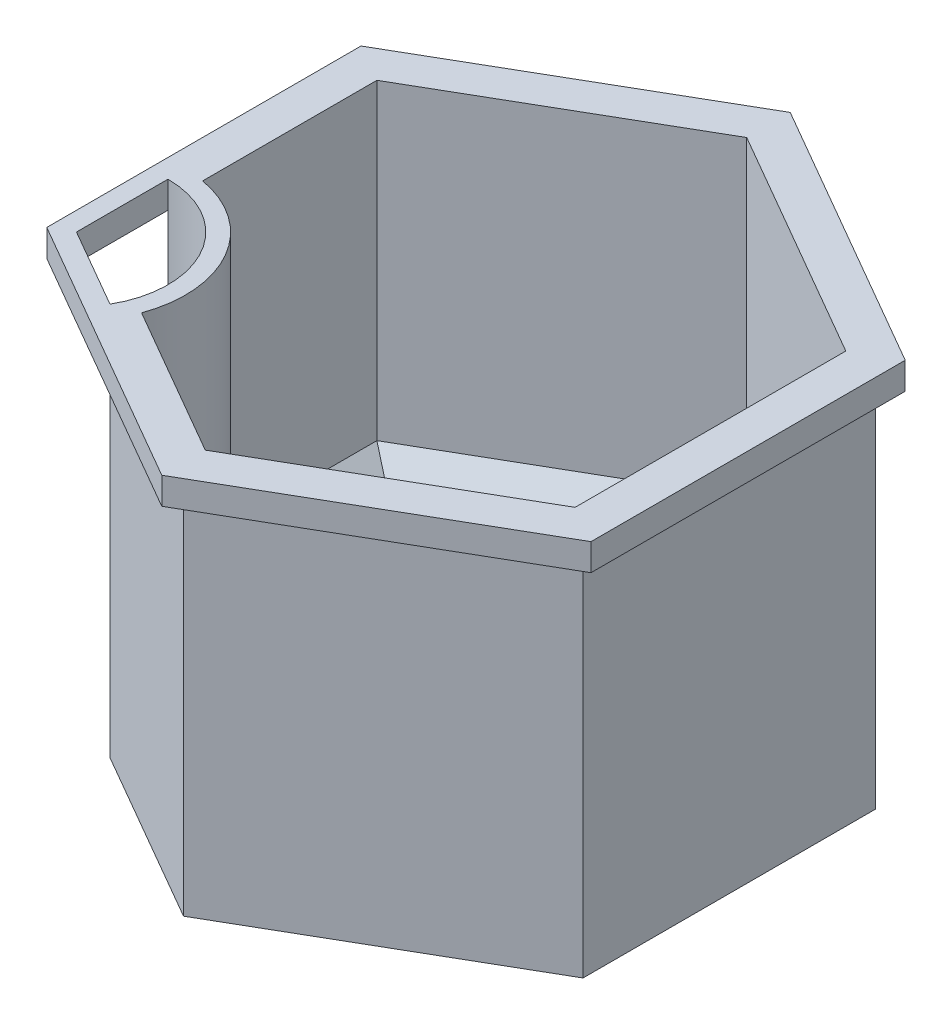
ISO-10303-21;
HEADER;
FILE_DESCRIPTION(('STEP AP214'),'2;1');
FILE_NAME('part.step','',(''),(''),'','','');
FILE_SCHEMA(('AUTOMOTIVE_DESIGN { 1 0 10303 214 1 1 1 1 }'));
ENDSEC;
DATA;
#1=APPLICATION_CONTEXT('core data for automotive mechanical design processes');
#2=APPLICATION_PROTOCOL_DEFINITION('international standard','automotive_design',2000,#1);
#3=PRODUCT_CONTEXT('',#1,'mechanical');
#4=PRODUCT('Part','Part','',(#3));
#5=PRODUCT_RELATED_PRODUCT_CATEGORY('part','',(#4));
#6=PRODUCT_DEFINITION_FORMATION('','',#4);
#7=PRODUCT_DEFINITION_CONTEXT('part definition',#1,'design');
#8=PRODUCT_DEFINITION('design','',#6,#7);
#9=PRODUCT_DEFINITION_SHAPE('','',#8);
#10=(LENGTH_UNIT() NAMED_UNIT(*) SI_UNIT(.MILLI.,.METRE.));
#11=(NAMED_UNIT(*) PLANE_ANGLE_UNIT() SI_UNIT($,.RADIAN.));
#12=(NAMED_UNIT(*) SI_UNIT($,.STERADIAN.) SOLID_ANGLE_UNIT());
#13=UNCERTAINTY_MEASURE_WITH_UNIT(LENGTH_MEASURE(1.E-05),#10,'distance_accuracy_value','');
#14=(GEOMETRIC_REPRESENTATION_CONTEXT(3) GLOBAL_UNCERTAINTY_ASSIGNED_CONTEXT((#13)) GLOBAL_UNIT_ASSIGNED_CONTEXT((#10,
#11,#12)) REPRESENTATION_CONTEXT('',''));
#15=CARTESIAN_POINT('',(0.,0.,0.));
#16=DIRECTION('',(0.,0.,1.));
#17=DIRECTION('',(1.,0.,0.));
#18=AXIS2_PLACEMENT_3D('',#15,#16,#17);
#19=CARTESIAN_POINT('',(-43.5772692216573,-63.,25.1593481156726));
#20=DIRECTION('',(-0.5,0.,0.866025403784439));
#21=DIRECTION('',(0.866025403784439,0.,0.5));
#22=AXIS2_PLACEMENT_3D('',#19,#20,#21);
#23=PLANE('',#22);
#24=DIRECTION('',(0.,1.,0.));
#25=VECTOR('',#24,1.);
#26=CARTESIAN_POINT('',(0.,-63.,50.3186962313452));
#27=LINE('',#26,#25);
#28=CARTESIAN_POINT('',(0.,-53.,50.3186962313452));
#29=VERTEX_POINT('',#28);
#30=CARTESIAN_POINT('',(0.,5.,50.3186962313452));
#31=VERTEX_POINT('',#30);
#32=EDGE_CURVE('E479',#29,#31,#27,.T.);
#33=ORIENTED_EDGE('',*,*,#32,.F.);
#34=DIRECTION('',(-0.866025403784439,0.,-0.5));
#35=VECTOR('',#34,1.);
#36=CARTESIAN_POINT('',(-43.5772692216573,-53.,25.1593481156726));
#37=LINE('',#36,#35);
#38=CARTESIAN_POINT('',(-28.0179829484626,-53.,34.1425062339));
#39=VERTEX_POINT('',#38);
#40=EDGE_CURVE('E11',#29,#39,#37,.T.);
#41=ORIENTED_EDGE('',*,*,#40,.T.);
#42=DIRECTION('',(0.,1.,0.));
#43=VECTOR('',#42,1.);
#44=CARTESIAN_POINT('',(-28.0179829484626,-68.,34.1425062339));
#45=LINE('',#44,#43);
#46=CARTESIAN_POINT('',(-28.0179829484626,5.,34.1425062339));
#47=VERTEX_POINT('',#46);
#48=EDGE_CURVE('E449',#39,#47,#45,.T.);
#49=ORIENTED_EDGE('',*,*,#48,.T.);
#50=DIRECTION('',(0.866025403784439,0.,0.5));
#51=VECTOR('',#50,1.);
#52=CARTESIAN_POINT('',(-43.5772692216573,5.,25.1593481156726));
#53=LINE('',#52,#51);
#54=EDGE_CURVE('E474',#47,#31,#53,.T.);
#55=ORIENTED_EDGE('',*,*,#54,.T.);
#56=EDGE_LOOP('',(#33,#41,#49,#55));
#57=FACE_BOUND('',#56,.T.);
#58=ADVANCED_FACE('F42',(#57),#23,.F.);
#59=CARTESIAN_POINT('',(-43.5772692216573,-63.,-25.1593481156726));
#60=DIRECTION('',(-1.,0.,0.));
#61=DIRECTION('',(0.,0.,1.));
#62=AXIS2_PLACEMENT_3D('',#59,#60,#61);
#63=PLANE('',#62);
#64=DIRECTION('',(0.,1.,0.));
#65=VECTOR('',#64,1.);
#66=CARTESIAN_POINT('',(-43.5772692216573,-68.,7.2337002478176));
#67=LINE('',#66,#65);
#68=CARTESIAN_POINT('',(-43.5772692216573,-53.,7.2337002478176));
#69=VERTEX_POINT('',#68);
#70=CARTESIAN_POINT('',(-43.5772692216573,5.,7.2337002478176));
#71=VERTEX_POINT('',#70);
#72=EDGE_CURVE('E448',#69,#71,#67,.T.);
#73=ORIENTED_EDGE('',*,*,#72,.F.);
#74=DIRECTION('',(0.,0.,-1.));
#75=VECTOR('',#74,1.);
#76=CARTESIAN_POINT('',(-43.5772692216573,-53.,-25.1593481156726));
#77=LINE('',#76,#75);
#78=CARTESIAN_POINT('',(-43.5772692216573,-53.,-25.1593481156726));
#79=VERTEX_POINT('',#78);
#80=EDGE_CURVE('E388',#69,#79,#77,.T.);
#81=ORIENTED_EDGE('',*,*,#80,.T.);
#82=DIRECTION('',(0.,1.,0.));
#83=VECTOR('',#82,1.);
#84=CARTESIAN_POINT('',(-43.5772692216573,-63.,-25.1593481156726));
#85=LINE('',#84,#83);
#86=CARTESIAN_POINT('',(-43.5772692216573,5.,-25.1593481156726));
#87=VERTEX_POINT('',#86);
#88=EDGE_CURVE('E482',#79,#87,#85,.T.);
#89=ORIENTED_EDGE('',*,*,#88,.T.);
#90=DIRECTION('',(0.,0.,1.));
#91=VECTOR('',#90,1.);
#92=CARTESIAN_POINT('',(-43.5772692216573,5.,-25.1593481156726));
#93=LINE('',#92,#91);
#94=EDGE_CURVE('E470',#87,#71,#93,.T.);
#95=ORIENTED_EDGE('',*,*,#94,.T.);
#96=EDGE_LOOP('',(#73,#81,#89,#95));
#97=FACE_BOUND('',#96,.T.);
#98=ADVANCED_FACE('F542',(#97),#63,.F.);
#99=CARTESIAN_POINT('',(0.,-63.,0.));
#100=DIRECTION('',(0.,1.,0.));
#101=DIRECTION('',(0.,0.,1.));
#102=AXIS2_PLACEMENT_3D('',#99,#100,#101);
#103=PLANE('',#102);
#104=DIRECTION('',(-0.866025403784439,0.,0.5));
#105=VECTOR('',#104,1.);
#106=CARTESIAN_POINT('',(-16.7886346108286,-63.,-29.0787681356645));
#107=LINE('',#106,#105);
#108=CARTESIAN_POINT('',(0.,-63.,-38.7716908475527));
#109=VERTEX_POINT('',#108);
#110=CARTESIAN_POINT('',(-33.5772692216572,-63.,-19.3858454237763));
#111=VERTEX_POINT('',#110);
#112=EDGE_CURVE('E375',#109,#111,#107,.T.);
#113=ORIENTED_EDGE('',*,*,#112,.T.);
#114=DIRECTION('',(0.,0.,1.));
#115=VECTOR('',#114,1.);
#116=CARTESIAN_POINT('',(-33.5772692216572,-63.,0.));
#117=LINE('',#116,#115);
#118=CARTESIAN_POINT('',(-33.5772692216572,-63.,12.07543763408));
#119=VERTEX_POINT('',#118);
#120=EDGE_CURVE('E378',#111,#119,#117,.T.);
#121=ORIENTED_EDGE('',*,*,#120,.T.);
#122=CARTESIAN_POINT('',(-47.0772692216573,-63.,27.2102505525071));
#123=DIRECTION('',(0.,1.,0.));
#124=DIRECTION('',(0.,0.,1.));
#125=AXIS2_PLACEMENT_3D('',#122,#123,#124);
#126=CIRCLE('',#125,20.2808422427618);
#127=CARTESIAN_POINT('',(-27.2272927843915,-63.,23.0520060291795));
#128=VERTEX_POINT('',#127);
#129=EDGE_CURVE('E359',#119,#128,#126,.F.);
#130=ORIENTED_EDGE('',*,*,#129,.T.);
#131=DIRECTION('',(0.866025403784439,0.,0.5));
#132=VECTOR('',#131,1.);
#133=CARTESIAN_POINT('',(-16.7886346108286,-63.,29.0787681356645));
#134=LINE('',#133,#132);
#135=CARTESIAN_POINT('',(0.,-63.,38.7716908475527));
#136=VERTEX_POINT('',#135);
#137=EDGE_CURVE('E363',#128,#136,#134,.T.);
#138=ORIENTED_EDGE('',*,*,#137,.T.);
#139=DIRECTION('',(0.866025403784439,0.,-0.5));
#140=VECTOR('',#139,1.);
#141=CARTESIAN_POINT('',(16.7886346108286,-63.,29.0787681356645));
#142=LINE('',#141,#140);
#143=CARTESIAN_POINT('',(33.5772692216572,-63.,19.3858454237763));
#144=VERTEX_POINT('',#143);
#145=EDGE_CURVE('E366',#136,#144,#142,.T.);
#146=ORIENTED_EDGE('',*,*,#145,.T.);
#147=DIRECTION('',(0.,0.,-1.));
#148=VECTOR('',#147,1.);
#149=CARTESIAN_POINT('',(33.5772692216572,-63.,0.));
#150=LINE('',#149,#148);
#151=CARTESIAN_POINT('',(33.5772692216572,-63.,-19.3858454237763));
#152=VERTEX_POINT('',#151);
#153=EDGE_CURVE('E369',#144,#152,#150,.T.);
#154=ORIENTED_EDGE('',*,*,#153,.T.);
#155=DIRECTION('',(-0.866025403784439,0.,-0.5));
#156=VECTOR('',#155,1.);
#157=CARTESIAN_POINT('',(16.7886346108286,-63.,-29.0787681356645));
#158=LINE('',#157,#156);
#159=EDGE_CURVE('E372',#152,#109,#158,.T.);
#160=ORIENTED_EDGE('',*,*,#159,.T.);
#161=EDGE_LOOP('',(#113,#121,#130,#138,#146,#154,#160));
#162=FACE_BOUND('',#161,.T.);
#163=ADVANCED_FACE('F548',(#162),#103,.T.);
#164=CARTESIAN_POINT('',(0.,5.,0.));
#165=DIRECTION('',(0.,1.,0.));
#166=DIRECTION('',(0.,0.,1.));
#167=AXIS2_PLACEMENT_3D('',#164,#165,#166);
#168=PLANE('',#167);
#169=DIRECTION('',(0.866025403784439,0.,0.5));
#170=VECTOR('',#169,1.);
#171=CARTESIAN_POINT('',(-47.0772692216573,5.,27.1800740578363));
#172=LINE('',#171,#170);
#173=CARTESIAN_POINT('',(-47.0772692216573,5.,27.1800740578363));
#174=VERTEX_POINT('',#173);
#175=CARTESIAN_POINT('',(-32.3548373573218,5.,35.6800740578363));
#176=VERTEX_POINT('',#175);
#177=EDGE_CURVE('E420',#174,#176,#172,.T.);
#178=ORIENTED_EDGE('',*,*,#177,.F.);
#179=DIRECTION('',(0.,0.,1.));
#180=VECTOR('',#179,1.);
#181=CARTESIAN_POINT('',(-47.0772692216573,5.,10.1800740578363));
#182=LINE('',#181,#180);
#183=CARTESIAN_POINT('',(-47.0772692216573,5.,10.1800740578363));
#184=VERTEX_POINT('',#183);
#185=EDGE_CURVE('E231',#184,#174,#182,.T.);
#186=ORIENTED_EDGE('',*,*,#185,.F.);
#187=CARTESIAN_POINT('',(-47.0772692216573,5.,27.1800740578363));
#188=DIRECTION('',(0.,1.,0.));
#189=DIRECTION('',(0.,0.,-1.));
#190=AXIS2_PLACEMENT_3D('',#187,#188,#189);
#191=CIRCLE('',#190,17.);
#192=EDGE_CURVE('E425',#176,#184,#191,.T.);
#193=ORIENTED_EDGE('',*,*,#192,.F.);
#194=EDGE_LOOP('',(#178,#186,#193));
#195=FACE_BOUND('',#194,.T.);
#196=ORIENTED_EDGE('',*,*,#54,.F.);
#197=CARTESIAN_POINT('',(-47.0772692216573,5.,27.2102505525071));
#198=DIRECTION('',(0.,1.,0.));
#199=DIRECTION('',(0.,0.,1.));
#200=AXIS2_PLACEMENT_3D('',#197,#198,#199);
#201=CIRCLE('',#200,20.2808422427618);
#202=EDGE_CURVE('E444',#71,#47,#201,.F.);
#203=ORIENTED_EDGE('',*,*,#202,.F.);
#204=ORIENTED_EDGE('',*,*,#94,.F.);
#205=DIRECTION('',(-0.866025403784439,0.,0.5));
#206=VECTOR('',#205,1.);
#207=CARTESIAN_POINT('',(0.,5.,-50.3186962313452));
#208=LINE('',#207,#206);
#209=CARTESIAN_POINT('',(0.,5.,-50.3186962313452));
#210=VERTEX_POINT('',#209);
#211=EDGE_CURVE('E466',#210,#87,#208,.T.);
#212=ORIENTED_EDGE('',*,*,#211,.F.);
#213=DIRECTION('',(-0.866025403784439,0.,-0.5));
#214=VECTOR('',#213,1.);
#215=CARTESIAN_POINT('',(43.5772692216573,5.,-25.1593481156726));
#216=LINE('',#215,#214);
#217=CARTESIAN_POINT('',(43.5772692216573,5.,-25.1593481156726));
#218=VERTEX_POINT('',#217);
#219=EDGE_CURVE('E462',#218,#210,#216,.T.);
#220=ORIENTED_EDGE('',*,*,#219,.F.);
#221=DIRECTION('',(0.,0.,-1.));
#222=VECTOR('',#221,1.);
#223=CARTESIAN_POINT('',(43.5772692216573,5.,25.1593481156726));
#224=LINE('',#223,#222);
#225=CARTESIAN_POINT('',(43.5772692216573,5.,25.1593481156726));
#226=VERTEX_POINT('',#225);
#227=EDGE_CURVE('E458',#226,#218,#224,.T.);
#228=ORIENTED_EDGE('',*,*,#227,.F.);
#229=DIRECTION('',(0.866025403784439,0.,-0.5));
#230=VECTOR('',#229,1.);
#231=CARTESIAN_POINT('',(0.,5.,50.3186962313452));
#232=LINE('',#231,#230);
#233=EDGE_CURVE('E452',#31,#226,#232,.T.);
#234=ORIENTED_EDGE('',*,*,#233,.F.);
#235=EDGE_LOOP('',(#196,#203,#204,#212,#220,#228,#234));
#236=FACE_BOUND('',#235,.T.);
#237=DIRECTION('',(0.866025403784438,0.,-0.5));
#238=VECTOR('',#237,1.);
#239=CARTESIAN_POINT('',(0.,5.,58.4016));
#240=LINE('',#239,#238);
#241=CARTESIAN_POINT('',(0.,5.,58.4016));
#242=VERTEX_POINT('',#241);
#243=CARTESIAN_POINT('',(50.5772692216572,5.,29.2008));
#244=VERTEX_POINT('',#243);
#245=EDGE_CURVE('E275',#242,#244,#240,.T.);
#246=ORIENTED_EDGE('',*,*,#245,.T.);
#247=DIRECTION('',(0.,0.,-1.));
#248=VECTOR('',#247,1.);
#249=CARTESIAN_POINT('',(50.5772692216572,5.,29.2008));
#250=LINE('',#249,#248);
#251=CARTESIAN_POINT('',(50.5772692216572,5.,-29.2008));
#252=VERTEX_POINT('',#251);
#253=EDGE_CURVE('E279',#244,#252,#250,.T.);
#254=ORIENTED_EDGE('',*,*,#253,.T.);
#255=DIRECTION('',(-0.866025403784438,0.,-0.5));
#256=VECTOR('',#255,1.);
#257=CARTESIAN_POINT('',(50.5772692216572,5.,-29.2008));
#258=LINE('',#257,#256);
#259=CARTESIAN_POINT('',(0.,5.,-58.4016));
#260=VERTEX_POINT('',#259);
#261=EDGE_CURVE('E283',#252,#260,#258,.T.);
#262=ORIENTED_EDGE('',*,*,#261,.T.);
#263=DIRECTION('',(-0.866025403784439,0.,0.5));
#264=VECTOR('',#263,1.);
#265=CARTESIAN_POINT('',(0.,5.,-58.4016));
#266=LINE('',#265,#264);
#267=CARTESIAN_POINT('',(-50.5772692216573,5.,-29.2008));
#268=VERTEX_POINT('',#267);
#269=EDGE_CURVE('E286',#260,#268,#266,.T.);
#270=ORIENTED_EDGE('',*,*,#269,.T.);
#271=DIRECTION('',(0.,0.,1.));
#272=VECTOR('',#271,1.);
#273=CARTESIAN_POINT('',(-50.5772692216573,5.,-29.2008));
#274=LINE('',#273,#272);
#275=CARTESIAN_POINT('',(-50.5772692216573,5.,29.2008));
#276=VERTEX_POINT('',#275);
#277=EDGE_CURVE('E289',#268,#276,#274,.T.);
#278=ORIENTED_EDGE('',*,*,#277,.T.);
#279=DIRECTION('',(0.866025403784439,0.,0.5));
#280=VECTOR('',#279,1.);
#281=CARTESIAN_POINT('',(-50.5772692216573,5.,29.2008));
#282=LINE('',#281,#280);
#283=EDGE_CURVE('E292',#276,#242,#282,.T.);
#284=ORIENTED_EDGE('',*,*,#283,.T.);
#285=EDGE_LOOP('',(#246,#254,#262,#270,#278,#284));
#286=FACE_BOUND('',#285,.T.);
#287=ADVANCED_FACE('F527',(#195,#236,#286),#168,.T.);
#288=CARTESIAN_POINT('',(0.,0.,0.));
#289=DIRECTION('',(0.,1.,0.));
#290=DIRECTION('',(0.,0.,1.));
#291=AXIS2_PLACEMENT_3D('',#288,#289,#290);
#292=PLANE('',#291);
#293=DIRECTION('',(0.866025403784439,0.,0.5));
#294=VECTOR('',#293,1.);
#295=CARTESIAN_POINT('',(-23.5386346108286,0.,40.7701110867545));
#296=LINE('',#295,#294);
#297=CARTESIAN_POINT('',(-47.0772692216573,0.,27.1800740578363));
#298=VERTEX_POINT('',#297);
#299=CARTESIAN_POINT('',(-32.3548373573218,0.,35.6800740578363));
#300=VERTEX_POINT('',#299);
#301=EDGE_CURVE('E352',#298,#300,#296,.T.);
#302=ORIENTED_EDGE('',*,*,#301,.T.);
#303=CARTESIAN_POINT('',(0.,0.,54.3601481156726));
#304=VERTEX_POINT('',#303);
#305=EDGE_CURVE('E238',#300,#304,#296,.T.);
#306=ORIENTED_EDGE('',*,*,#305,.T.);
#307=DIRECTION('',(0.866025403784439,0.,-0.5));
#308=VECTOR('',#307,1.);
#309=CARTESIAN_POINT('',(23.5386346108286,0.,40.7701110867545));
#310=LINE('',#309,#308);
#311=CARTESIAN_POINT('',(47.0772692216573,0.,27.1800740578363));
#312=VERTEX_POINT('',#311);
#313=EDGE_CURVE('E355',#304,#312,#310,.T.);
#314=ORIENTED_EDGE('',*,*,#313,.T.);
#315=DIRECTION('',(0.,0.,-1.));
#316=VECTOR('',#315,1.);
#317=CARTESIAN_POINT('',(47.0772692216573,0.,0.));
#318=LINE('',#317,#316);
#319=CARTESIAN_POINT('',(47.0772692216573,0.,-27.1800740578363));
#320=VERTEX_POINT('',#319);
#321=EDGE_CURVE('E336',#312,#320,#318,.T.);
#322=ORIENTED_EDGE('',*,*,#321,.T.);
#323=DIRECTION('',(-0.866025403784439,0.,-0.5));
#324=VECTOR('',#323,1.);
#325=CARTESIAN_POINT('',(23.5386346108286,0.,-40.7701110867545));
#326=LINE('',#325,#324);
#327=CARTESIAN_POINT('',(0.,0.,-54.3601481156726));
#328=VERTEX_POINT('',#327);
#329=EDGE_CURVE('E340',#320,#328,#326,.T.);
#330=ORIENTED_EDGE('',*,*,#329,.T.);
#331=DIRECTION('',(-0.866025403784439,0.,0.5));
#332=VECTOR('',#331,1.);
#333=CARTESIAN_POINT('',(-23.5386346108286,0.,-40.7701110867545));
#334=LINE('',#333,#332);
#335=CARTESIAN_POINT('',(-47.0772692216573,0.,-27.1800740578363));
#336=VERTEX_POINT('',#335);
#337=EDGE_CURVE('E344',#328,#336,#334,.T.);
#338=ORIENTED_EDGE('',*,*,#337,.T.);
#339=DIRECTION('',(0.,0.,1.));
#340=VECTOR('',#339,1.);
#341=CARTESIAN_POINT('',(-47.0772692216573,0.,0.));
#342=LINE('',#341,#340);
#343=CARTESIAN_POINT('',(-47.0772692216573,0.,10.1800740578363));
#344=VERTEX_POINT('',#343);
#345=EDGE_CURVE('E348',#336,#344,#342,.T.);
#346=ORIENTED_EDGE('',*,*,#345,.T.);
#347=DIRECTION('',(0.,0.,1.));
#348=VECTOR('',#347,1.);
#349=CARTESIAN_POINT('',(-47.0772692216573,0.,0.));
#350=LINE('',#349,#348);
#351=EDGE_CURVE('E438',#344,#298,#350,.T.);
#352=ORIENTED_EDGE('',*,*,#351,.T.);
#353=EDGE_LOOP('',(#302,#306,#314,#322,#330,#338,#346,#352));
#354=FACE_BOUND('',#353,.T.);
#355=DIRECTION('',(0.866025403784438,0.,-0.5));
#356=VECTOR('',#355,1.);
#357=CARTESIAN_POINT('',(0.,0.,58.4016));
#358=LINE('',#357,#356);
#359=CARTESIAN_POINT('',(0.,0.,58.4016));
#360=VERTEX_POINT('',#359);
#361=CARTESIAN_POINT('',(50.5772692216572,0.,29.2008));
#362=VERTEX_POINT('',#361);
#363=EDGE_CURVE('E264',#360,#362,#358,.T.);
#364=ORIENTED_EDGE('',*,*,#363,.F.);
#365=DIRECTION('',(0.866025403784439,0.,0.5));
#366=VECTOR('',#365,1.);
#367=CARTESIAN_POINT('',(-50.5772692216573,0.,29.2008));
#368=LINE('',#367,#366);
#369=CARTESIAN_POINT('',(-50.5772692216573,0.,29.2008));
#370=VERTEX_POINT('',#369);
#371=EDGE_CURVE('E280',#370,#360,#368,.T.);
#372=ORIENTED_EDGE('',*,*,#371,.F.);
#373=DIRECTION('',(0.,0.,1.));
#374=VECTOR('',#373,1.);
#375=CARTESIAN_POINT('',(-50.5772692216573,0.,-29.2008));
#376=LINE('',#375,#374);
#377=CARTESIAN_POINT('',(-50.5772692216573,0.,-29.2008));
#378=VERTEX_POINT('',#377);
#379=EDGE_CURVE('E308',#378,#370,#376,.T.);
#380=ORIENTED_EDGE('',*,*,#379,.F.);
#381=DIRECTION('',(-0.866025403784439,0.,0.5));
#382=VECTOR('',#381,1.);
#383=CARTESIAN_POINT('',(0.,0.,-58.4016));
#384=LINE('',#383,#382);
#385=CARTESIAN_POINT('',(0.,0.,-58.4016));
#386=VERTEX_POINT('',#385);
#387=EDGE_CURVE('E305',#386,#378,#384,.T.);
#388=ORIENTED_EDGE('',*,*,#387,.F.);
#389=DIRECTION('',(-0.866025403784438,0.,-0.5));
#390=VECTOR('',#389,1.);
#391=CARTESIAN_POINT('',(50.5772692216572,0.,-29.2008));
#392=LINE('',#391,#390);
#393=CARTESIAN_POINT('',(50.5772692216572,0.,-29.2008));
#394=VERTEX_POINT('',#393);
#395=EDGE_CURVE('E302',#394,#386,#392,.T.);
#396=ORIENTED_EDGE('',*,*,#395,.F.);
#397=DIRECTION('',(0.,0.,-1.));
#398=VECTOR('',#397,1.);
#399=CARTESIAN_POINT('',(50.5772692216572,0.,29.2008));
#400=LINE('',#399,#398);
#401=EDGE_CURVE('E299',#362,#394,#400,.T.);
#402=ORIENTED_EDGE('',*,*,#401,.F.);
#403=EDGE_LOOP('',(#364,#372,#380,#388,#396,#402));
#404=FACE_BOUND('',#403,.T.);
#405=ADVANCED_FACE('F517',(#354,#404),#292,.F.);
#406=CARTESIAN_POINT('',(0.,5.,58.4016));
#407=DIRECTION('',(-0.5,0.,-0.866025403784439));
#408=DIRECTION('',(-0.866025403784439,0.,0.5));
#409=AXIS2_PLACEMENT_3D('',#406,#407,#408);
#410=PLANE('',#409);
#411=ORIENTED_EDGE('',*,*,#363,.T.);
#412=DIRECTION('',(0.,-1.,0.));
#413=VECTOR('',#412,1.);
#414=CARTESIAN_POINT('',(50.5772692216572,5.,29.2008));
#415=LINE('',#414,#413);
#416=EDGE_CURVE('E332',#244,#362,#415,.T.);
#417=ORIENTED_EDGE('',*,*,#416,.F.);
#418=ORIENTED_EDGE('',*,*,#245,.F.);
#419=DIRECTION('',(0.,-1.,0.));
#420=VECTOR('',#419,1.);
#421=CARTESIAN_POINT('',(0.,5.,58.4016));
#422=LINE('',#421,#420);
#423=EDGE_CURVE('E295',#242,#360,#422,.T.);
#424=ORIENTED_EDGE('',*,*,#423,.T.);
#425=EDGE_LOOP('',(#411,#417,#418,#424));
#426=FACE_BOUND('',#425,.T.);
#427=ADVANCED_FACE('F586',(#426),#410,.F.);
#428=CARTESIAN_POINT('',(50.5772692216572,5.,29.2008));
#429=DIRECTION('',(-1.,0.,0.));
#430=DIRECTION('',(0.,0.,1.));
#431=AXIS2_PLACEMENT_3D('',#428,#429,#430);
#432=PLANE('',#431);
#433=ORIENTED_EDGE('',*,*,#401,.T.);
#434=DIRECTION('',(0.,-1.,0.));
#435=VECTOR('',#434,1.);
#436=CARTESIAN_POINT('',(50.5772692216572,5.,-29.2008));
#437=LINE('',#436,#435);
#438=EDGE_CURVE('E328',#252,#394,#437,.T.);
#439=ORIENTED_EDGE('',*,*,#438,.F.);
#440=ORIENTED_EDGE('',*,*,#253,.F.);
#441=ORIENTED_EDGE('',*,*,#416,.T.);
#442=EDGE_LOOP('',(#433,#439,#440,#441));
#443=FACE_BOUND('',#442,.T.);
#444=ADVANCED_FACE('F601',(#443),#432,.F.);
#445=CARTESIAN_POINT('',(50.5772692216572,5.,-29.2008));
#446=DIRECTION('',(-0.5,0.,0.866025403784439));
#447=DIRECTION('',(0.866025403784439,0.,0.5));
#448=AXIS2_PLACEMENT_3D('',#445,#446,#447);
#449=PLANE('',#448);
#450=ORIENTED_EDGE('',*,*,#395,.T.);
#451=DIRECTION('',(0.,-1.,0.));
#452=VECTOR('',#451,1.);
#453=CARTESIAN_POINT('',(0.,5.,-58.4016));
#454=LINE('',#453,#452);
#455=EDGE_CURVE('E324',#260,#386,#454,.T.);
#456=ORIENTED_EDGE('',*,*,#455,.F.);
#457=ORIENTED_EDGE('',*,*,#261,.F.);
#458=ORIENTED_EDGE('',*,*,#438,.T.);
#459=EDGE_LOOP('',(#450,#456,#457,#458));
#460=FACE_BOUND('',#459,.T.);
#461=ADVANCED_FACE('F597',(#460),#449,.F.);
#462=CARTESIAN_POINT('',(0.,5.,-58.4016));
#463=DIRECTION('',(0.5,0.,0.866025403784439));
#464=DIRECTION('',(0.866025403784439,0.,-0.5));
#465=AXIS2_PLACEMENT_3D('',#462,#463,#464);
#466=PLANE('',#465);
#467=ORIENTED_EDGE('',*,*,#387,.T.);
#468=DIRECTION('',(0.,-1.,0.));
#469=VECTOR('',#468,1.);
#470=CARTESIAN_POINT('',(-50.5772692216573,5.,-29.2008));
#471=LINE('',#470,#469);
#472=EDGE_CURVE('E320',#268,#378,#471,.T.);
#473=ORIENTED_EDGE('',*,*,#472,.F.);
#474=ORIENTED_EDGE('',*,*,#269,.F.);
#475=ORIENTED_EDGE('',*,*,#455,.T.);
#476=EDGE_LOOP('',(#467,#473,#474,#475));
#477=FACE_BOUND('',#476,.T.);
#478=ADVANCED_FACE('F593',(#477),#466,.F.);
#479=CARTESIAN_POINT('',(-50.5772692216573,5.,-29.2008));
#480=DIRECTION('',(1.,0.,0.));
#481=DIRECTION('',(0.,0.,-1.));
#482=AXIS2_PLACEMENT_3D('',#479,#480,#481);
#483=PLANE('',#482);
#484=ORIENTED_EDGE('',*,*,#379,.T.);
#485=DIRECTION('',(0.,-1.,0.));
#486=VECTOR('',#485,1.);
#487=CARTESIAN_POINT('',(-50.5772692216573,5.,29.2008));
#488=LINE('',#487,#486);
#489=EDGE_CURVE('E316',#276,#370,#488,.T.);
#490=ORIENTED_EDGE('',*,*,#489,.F.);
#491=ORIENTED_EDGE('',*,*,#277,.F.);
#492=ORIENTED_EDGE('',*,*,#472,.T.);
#493=EDGE_LOOP('',(#484,#490,#491,#492));
#494=FACE_BOUND('',#493,.T.);
#495=ADVANCED_FACE('F589',(#494),#483,.F.);
#496=CARTESIAN_POINT('',(-50.5772692216573,5.,29.2008));
#497=DIRECTION('',(0.5,0.,-0.866025403784439));
#498=DIRECTION('',(-0.866025403784439,0.,-0.5));
#499=AXIS2_PLACEMENT_3D('',#496,#497,#498);
#500=PLANE('',#499);
#501=ORIENTED_EDGE('',*,*,#371,.T.);
#502=ORIENTED_EDGE('',*,*,#423,.F.);
#503=ORIENTED_EDGE('',*,*,#283,.F.);
#504=ORIENTED_EDGE('',*,*,#489,.T.);
#505=EDGE_LOOP('',(#501,#502,#503,#504));
#506=FACE_BOUND('',#505,.T.);
#507=ADVANCED_FACE('F581',(#506),#500,.F.);
#508=CARTESIAN_POINT('',(0.,-68.,54.3601481156726));
#509=DIRECTION('',(0.5,0.,0.866025403784439));
#510=DIRECTION('',(0.866025403784439,0.,-0.5));
#511=AXIS2_PLACEMENT_3D('',#508,#509,#510);
#512=PLANE('',#511);
#513=ORIENTED_EDGE('',*,*,#313,.F.);
#514=DIRECTION('',(0.,1.,0.));
#515=VECTOR('',#514,1.);
#516=CARTESIAN_POINT('',(0.,-68.,54.3601481156726));
#517=LINE('',#516,#515);
#518=CARTESIAN_POINT('',(0.,-68.,54.3601481156726));
#519=VERTEX_POINT('',#518);
#520=EDGE_CURVE('E261',#519,#304,#517,.T.);
#521=ORIENTED_EDGE('',*,*,#520,.F.);
#522=DIRECTION('',(0.866025403784439,0.,-0.5));
#523=VECTOR('',#522,1.);
#524=CARTESIAN_POINT('',(0.,-68.,54.3601481156726));
#525=LINE('',#524,#523);
#526=CARTESIAN_POINT('',(47.0772692216573,-68.,27.1800740578363));
#527=VERTEX_POINT('',#526);
#528=EDGE_CURVE('E247',#519,#527,#525,.T.);
#529=ORIENTED_EDGE('',*,*,#528,.T.);
#530=DIRECTION('',(0.,1.,0.));
#531=VECTOR('',#530,1.);
#532=CARTESIAN_POINT('',(47.0772692216573,-68.,27.1800740578363));
#533=LINE('',#532,#531);
#534=EDGE_CURVE('E249',#527,#312,#533,.T.);
#535=ORIENTED_EDGE('',*,*,#534,.T.);
#536=EDGE_LOOP('',(#513,#521,#529,#535));
#537=FACE_BOUND('',#536,.T.);
#538=ADVANCED_FACE('F515',(#537),#512,.T.);
#539=CARTESIAN_POINT('',(-47.0772692216573,-68.,27.1800740578363));
#540=DIRECTION('',(-0.5,0.,0.866025403784438));
#541=DIRECTION('',(0.866025403784439,0.,0.5));
#542=AXIS2_PLACEMENT_3D('',#539,#540,#541);
#543=PLANE('',#542);
#544=DIRECTION('',(0.,1.,0.));
#545=VECTOR('',#544,1.);
#546=CARTESIAN_POINT('',(-32.3548373573218,-68.,35.6800740578363));
#547=LINE('',#546,#545);
#548=CARTESIAN_POINT('',(-32.3548373573218,-68.,35.6800740578363));
#549=VERTEX_POINT('',#548);
#550=EDGE_CURVE('E220',#549,#300,#547,.T.);
#551=ORIENTED_EDGE('',*,*,#550,.F.);
#552=DIRECTION('',(0.866025403784439,0.,0.5));
#553=VECTOR('',#552,1.);
#554=CARTESIAN_POINT('',(-47.0772692216573,-68.,27.1800740578363));
#555=LINE('',#554,#553);
#556=EDGE_CURVE('E236',#549,#519,#555,.T.);
#557=ORIENTED_EDGE('',*,*,#556,.T.);
#558=ORIENTED_EDGE('',*,*,#520,.T.);
#559=ORIENTED_EDGE('',*,*,#305,.F.);
#560=EDGE_LOOP('',(#551,#557,#558,#559));
#561=FACE_BOUND('',#560,.T.);
#562=ADVANCED_FACE('F234',(#561),#543,.T.);
#563=CARTESIAN_POINT('',(-47.0772692216573,-68.,-27.1800740578363));
#564=DIRECTION('',(-1.,0.,0.));
#565=DIRECTION('',(0.,0.,1.));
#566=AXIS2_PLACEMENT_3D('',#563,#564,#565);
#567=PLANE('',#566);
#568=DIRECTION('',(0.,1.,0.));
#569=VECTOR('',#568,1.);
#570=CARTESIAN_POINT('',(-47.0772692216573,-68.,10.1800740578363));
#571=LINE('',#570,#569);
#572=CARTESIAN_POINT('',(-47.0772692216573,-68.,10.1800740578363));
#573=VERTEX_POINT('',#572);
#574=EDGE_CURVE('E224',#573,#344,#571,.T.);
#575=ORIENTED_EDGE('',*,*,#574,.T.);
#576=ORIENTED_EDGE('',*,*,#345,.F.);
#577=DIRECTION('',(0.,1.,0.));
#578=VECTOR('',#577,1.);
#579=CARTESIAN_POINT('',(-47.0772692216573,-68.,-27.1800740578363));
#580=LINE('',#579,#578);
#581=CARTESIAN_POINT('',(-47.0772692216573,-68.,-27.1800740578363));
#582=VERTEX_POINT('',#581);
#583=EDGE_CURVE('E265',#582,#336,#580,.T.);
#584=ORIENTED_EDGE('',*,*,#583,.F.);
#585=DIRECTION('',(0.,0.,1.));
#586=VECTOR('',#585,1.);
#587=CARTESIAN_POINT('',(-47.0772692216573,-68.,-27.1800740578363));
#588=LINE('',#587,#586);
#589=EDGE_CURVE('E250',#582,#573,#588,.T.);
#590=ORIENTED_EDGE('',*,*,#589,.T.);
#591=EDGE_LOOP('',(#575,#576,#584,#590));
#592=FACE_BOUND('',#591,.T.);
#593=ADVANCED_FACE('F532',(#592),#567,.T.);
#594=CARTESIAN_POINT('',(0.,-68.,-54.3601481156726));
#595=DIRECTION('',(-0.5,0.,-0.866025403784438));
#596=DIRECTION('',(-0.866025403784439,0.,0.5));
#597=AXIS2_PLACEMENT_3D('',#594,#595,#596);
#598=PLANE('',#597);
#599=ORIENTED_EDGE('',*,*,#337,.F.);
#600=DIRECTION('',(0.,1.,0.));
#601=VECTOR('',#600,1.);
#602=CARTESIAN_POINT('',(0.,-68.,-54.3601481156726));
#603=LINE('',#602,#601);
#604=CARTESIAN_POINT('',(0.,-68.,-54.3601481156726));
#605=VERTEX_POINT('',#604);
#606=EDGE_CURVE('E269',#605,#328,#603,.T.);
#607=ORIENTED_EDGE('',*,*,#606,.F.);
#608=DIRECTION('',(-0.866025403784439,0.,0.5));
#609=VECTOR('',#608,1.);
#610=CARTESIAN_POINT('',(0.,-68.,-54.3601481156726));
#611=LINE('',#610,#609);
#612=EDGE_CURVE('E257',#605,#582,#611,.T.);
#613=ORIENTED_EDGE('',*,*,#612,.T.);
#614=ORIENTED_EDGE('',*,*,#583,.T.);
#615=EDGE_LOOP('',(#599,#607,#613,#614));
#616=FACE_BOUND('',#615,.T.);
#617=ADVANCED_FACE('F506',(#616),#598,.T.);
#618=CARTESIAN_POINT('',(47.0772692216573,-68.,-27.1800740578363));
#619=DIRECTION('',(0.5,0.,-0.866025403784439));
#620=DIRECTION('',(-0.866025403784439,0.,-0.5));
#621=AXIS2_PLACEMENT_3D('',#618,#619,#620);
#622=PLANE('',#621);
#623=ORIENTED_EDGE('',*,*,#329,.F.);
#624=DIRECTION('',(0.,1.,0.));
#625=VECTOR('',#624,1.);
#626=CARTESIAN_POINT('',(47.0772692216573,-68.,-27.1800740578363));
#627=LINE('',#626,#625);
#628=CARTESIAN_POINT('',(47.0772692216573,-68.,-27.1800740578363));
#629=VERTEX_POINT('',#628);
#630=EDGE_CURVE('E255',#629,#320,#627,.T.);
#631=ORIENTED_EDGE('',*,*,#630,.F.);
#632=DIRECTION('',(-0.866025403784439,0.,-0.5));
#633=VECTOR('',#632,1.);
#634=CARTESIAN_POINT('',(47.0772692216573,-68.,-27.1800740578363));
#635=LINE('',#634,#633);
#636=EDGE_CURVE('E499',#629,#605,#635,.T.);
#637=ORIENTED_EDGE('',*,*,#636,.T.);
#638=ORIENTED_EDGE('',*,*,#606,.T.);
#639=EDGE_LOOP('',(#623,#631,#637,#638));
#640=FACE_BOUND('',#639,.T.);
#641=ADVANCED_FACE('F510',(#640),#622,.T.);
#642=CARTESIAN_POINT('',(47.0772692216573,-68.,27.1800740578363));
#643=DIRECTION('',(1.,0.,0.));
#644=DIRECTION('',(0.,0.,-1.));
#645=AXIS2_PLACEMENT_3D('',#642,#643,#644);
#646=PLANE('',#645);
#647=ORIENTED_EDGE('',*,*,#321,.F.);
#648=ORIENTED_EDGE('',*,*,#534,.F.);
#649=DIRECTION('',(0.,0.,-1.));
#650=VECTOR('',#649,1.);
#651=CARTESIAN_POINT('',(47.0772692216573,-68.,27.1800740578363));
#652=LINE('',#651,#650);
#653=EDGE_CURVE('E495',#527,#629,#652,.T.);
#654=ORIENTED_EDGE('',*,*,#653,.T.);
#655=ORIENTED_EDGE('',*,*,#630,.T.);
#656=EDGE_LOOP('',(#647,#648,#654,#655));
#657=FACE_BOUND('',#656,.T.);
#658=ADVANCED_FACE('F512',(#657),#646,.T.);
#659=CARTESIAN_POINT('',(0.,-68.,0.));
#660=DIRECTION('',(0.,1.,0.));
#661=DIRECTION('',(0.,0.,1.));
#662=AXIS2_PLACEMENT_3D('',#659,#660,#661);
#663=PLANE('',#662);
#664=ORIENTED_EDGE('',*,*,#556,.F.);
#665=CARTESIAN_POINT('',(-47.0772692216573,-68.,27.1800740578363));
#666=DIRECTION('',(0.,1.,0.));
#667=DIRECTION('',(0.,0.,-1.));
#668=AXIS2_PLACEMENT_3D('',#665,#666,#667);
#669=CIRCLE('',#668,17.);
#670=EDGE_CURVE('E215',#549,#573,#669,.T.);
#671=ORIENTED_EDGE('',*,*,#670,.T.);
#672=ORIENTED_EDGE('',*,*,#589,.F.);
#673=ORIENTED_EDGE('',*,*,#612,.F.);
#674=ORIENTED_EDGE('',*,*,#636,.F.);
#675=ORIENTED_EDGE('',*,*,#653,.F.);
#676=ORIENTED_EDGE('',*,*,#528,.F.);
#677=EDGE_LOOP('',(#664,#671,#672,#673,#674,#675,#676));
#678=FACE_BOUND('',#677,.T.);
#679=ADVANCED_FACE('F244',(#678),#663,.F.);
#680=CARTESIAN_POINT('',(0.,-63.,50.3186962313452));
#681=DIRECTION('',(0.5,0.,0.866025403784439));
#682=DIRECTION('',(0.866025403784439,0.,-0.5));
#683=AXIS2_PLACEMENT_3D('',#680,#681,#682);
#684=PLANE('',#683);
#685=DIRECTION('',(0.,1.,0.));
#686=VECTOR('',#685,1.);
#687=CARTESIAN_POINT('',(43.5772692216573,-63.,25.1593481156726));
#688=LINE('',#687,#686);
#689=CARTESIAN_POINT('',(43.5772692216573,-53.,25.1593481156726));
#690=VERTEX_POINT('',#689);
#691=EDGE_CURVE('E478',#690,#226,#688,.T.);
#692=ORIENTED_EDGE('',*,*,#691,.F.);
#693=DIRECTION('',(-0.866025403784439,0.,0.5));
#694=VECTOR('',#693,1.);
#695=CARTESIAN_POINT('',(0.,-53.,50.3186962313452));
#696=LINE('',#695,#694);
#697=EDGE_CURVE('E53',#690,#29,#696,.T.);
#698=ORIENTED_EDGE('',*,*,#697,.T.);
#699=ORIENTED_EDGE('',*,*,#32,.T.);
#700=ORIENTED_EDGE('',*,*,#233,.T.);
#701=EDGE_LOOP('',(#692,#698,#699,#700));
#702=FACE_BOUND('',#701,.T.);
#703=ADVANCED_FACE('F558',(#702),#684,.F.);
#704=CARTESIAN_POINT('',(0.,-63.,-50.3186962313452));
#705=DIRECTION('',(-0.5,0.,-0.866025403784439));
#706=DIRECTION('',(-0.866025403784439,0.,0.5));
#707=AXIS2_PLACEMENT_3D('',#704,#705,#706);
#708=PLANE('',#707);
#709=ORIENTED_EDGE('',*,*,#88,.F.);
#710=DIRECTION('',(0.866025403784439,0.,-0.5));
#711=VECTOR('',#710,1.);
#712=CARTESIAN_POINT('',(0.,-53.,-50.3186962313452));
#713=LINE('',#712,#711);
#714=CARTESIAN_POINT('',(0.,-53.,-50.3186962313452));
#715=VERTEX_POINT('',#714);
#716=EDGE_CURVE('E391',#79,#715,#713,.T.);
#717=ORIENTED_EDGE('',*,*,#716,.T.);
#718=DIRECTION('',(0.,1.,0.));
#719=VECTOR('',#718,1.);
#720=CARTESIAN_POINT('',(0.,-63.,-50.3186962313452));
#721=LINE('',#720,#719);
#722=EDGE_CURVE('E485',#715,#210,#721,.T.);
#723=ORIENTED_EDGE('',*,*,#722,.T.);
#724=ORIENTED_EDGE('',*,*,#211,.T.);
#725=EDGE_LOOP('',(#709,#717,#723,#724));
#726=FACE_BOUND('',#725,.T.);
#727=ADVANCED_FACE('F554',(#726),#708,.F.);
#728=CARTESIAN_POINT('',(43.5772692216573,-63.,-25.1593481156726));
#729=DIRECTION('',(0.5,0.,-0.866025403784439));
#730=DIRECTION('',(-0.866025403784439,0.,-0.5));
#731=AXIS2_PLACEMENT_3D('',#728,#729,#730);
#732=PLANE('',#731);
#733=ORIENTED_EDGE('',*,*,#722,.F.);
#734=DIRECTION('',(0.866025403784439,0.,0.5));
#735=VECTOR('',#734,1.);
#736=CARTESIAN_POINT('',(43.5772692216573,-53.,-25.1593481156726));
#737=LINE('',#736,#735);
#738=CARTESIAN_POINT('',(43.5772692216573,-53.,-25.1593481156726));
#739=VERTEX_POINT('',#738);
#740=EDGE_CURVE('E394',#715,#739,#737,.T.);
#741=ORIENTED_EDGE('',*,*,#740,.T.);
#742=DIRECTION('',(0.,1.,0.));
#743=VECTOR('',#742,1.);
#744=CARTESIAN_POINT('',(43.5772692216573,-63.,-25.1593481156726));
#745=LINE('',#744,#743);
#746=EDGE_CURVE('E488',#739,#218,#745,.T.);
#747=ORIENTED_EDGE('',*,*,#746,.T.);
#748=ORIENTED_EDGE('',*,*,#219,.T.);
#749=EDGE_LOOP('',(#733,#741,#747,#748));
#750=FACE_BOUND('',#749,.T.);
#751=ADVANCED_FACE('F557',(#750),#732,.F.);
#752=CARTESIAN_POINT('',(43.5772692216573,-63.,25.1593481156726));
#753=DIRECTION('',(1.,0.,0.));
#754=DIRECTION('',(0.,0.,-1.));
#755=AXIS2_PLACEMENT_3D('',#752,#753,#754);
#756=PLANE('',#755);
#757=ORIENTED_EDGE('',*,*,#746,.F.);
#758=DIRECTION('',(0.,0.,1.));
#759=VECTOR('',#758,1.);
#760=CARTESIAN_POINT('',(43.5772692216573,-53.,25.1593481156726));
#761=LINE('',#760,#759);
#762=EDGE_CURVE('E68',#739,#690,#761,.T.);
#763=ORIENTED_EDGE('',*,*,#762,.T.);
#764=ORIENTED_EDGE('',*,*,#691,.T.);
#765=ORIENTED_EDGE('',*,*,#227,.T.);
#766=EDGE_LOOP('',(#757,#763,#764,#765));
#767=FACE_BOUND('',#766,.T.);
#768=ADVANCED_FACE('F562',(#767),#756,.F.);
#769=CARTESIAN_POINT('',(-47.0772692216573,-68.,27.2102505525071));
#770=DIRECTION('',(0.,1.,0.));
#771=DIRECTION('',(0.,0.,1.));
#772=AXIS2_PLACEMENT_3D('',#769,#770,#771);
#773=CYLINDRICAL_SURFACE('',#772,20.2808422427618);
#774=ORIENTED_EDGE('',*,*,#129,.F.);
#775=CARTESIAN_POINT('',(-47.0772692216573,-49.5000000000001,27.2102505525071));
#776=DIRECTION('',(-0.707106781186544,-0.707106781186551,0.));
#777=DIRECTION('',(-0.707106781186551,0.707106781186544,0.));
#778=AXIS2_PLACEMENT_3D('',#775,#776,#777);
#779=ELLIPSE('',#778,28.6814421560628,20.2808422427618);
#780=EDGE_CURVE('E385',#119,#69,#779,.F.);
#781=ORIENTED_EDGE('',*,*,#780,.T.);
#782=ORIENTED_EDGE('',*,*,#72,.T.);
#783=ORIENTED_EDGE('',*,*,#202,.T.);
#784=ORIENTED_EDGE('',*,*,#48,.F.);
#785=CARTESIAN_POINT('',(-47.0772692216573,-49.473866389018,27.2102505525071));
#786=DIRECTION('',(-0.353553390593272,-0.707106781186551,0.612372435695792));
#787=DIRECTION('',(-0.353553390593275,0.707106781186544,0.612372435695797));
#788=AXIS2_PLACEMENT_3D('',#785,#786,#787);
#789=ELLIPSE('',#788,28.6814421560628,20.2808422427618);
#790=EDGE_CURVE('E382',#39,#128,#789,.F.);
#791=ORIENTED_EDGE('',*,*,#790,.T.);
#792=EDGE_LOOP('',(#774,#781,#782,#783,#784,#791));
#793=FACE_BOUND('',#792,.T.);
#794=ADVANCED_FACE('F566',(#793),#773,.T.);
#795=CARTESIAN_POINT('',(-47.0772692216573,-68.,27.1800740578363));
#796=DIRECTION('',(-0.5,0.,0.866025403784438));
#797=DIRECTION('',(0.866025403784439,0.,0.5));
#798=AXIS2_PLACEMENT_3D('',#795,#796,#797);
#799=PLANE('',#798);
#800=DIRECTION('',(0.,1.,0.));
#801=VECTOR('',#800,1.);
#802=CARTESIAN_POINT('',(-47.0772692216573,-68.,27.1800740578363));
#803=LINE('',#802,#801);
#804=EDGE_CURVE('E435',#298,#174,#803,.T.);
#805=ORIENTED_EDGE('',*,*,#804,.T.);
#806=ORIENTED_EDGE('',*,*,#177,.T.);
#807=EDGE_CURVE('E230',#300,#176,#547,.T.);
#808=ORIENTED_EDGE('',*,*,#807,.F.);
#809=ORIENTED_EDGE('',*,*,#301,.F.);
#810=EDGE_LOOP('',(#805,#806,#808,#809));
#811=FACE_BOUND('',#810,.T.);
#812=ADVANCED_FACE('F521',(#811),#799,.F.);
#813=CARTESIAN_POINT('',(-47.0772692216573,-68.,10.1800740578363));
#814=DIRECTION('',(-1.,0.,0.));
#815=DIRECTION('',(0.,0.,1.));
#816=AXIS2_PLACEMENT_3D('',#813,#814,#815);
#817=PLANE('',#816);
#818=EDGE_CURVE('E241',#344,#184,#571,.T.);
#819=ORIENTED_EDGE('',*,*,#818,.T.);
#820=ORIENTED_EDGE('',*,*,#185,.T.);
#821=ORIENTED_EDGE('',*,*,#804,.F.);
#822=ORIENTED_EDGE('',*,*,#351,.F.);
#823=EDGE_LOOP('',(#819,#820,#821,#822));
#824=FACE_BOUND('',#823,.T.);
#825=ADVANCED_FACE('F523',(#824),#817,.F.);
#826=CARTESIAN_POINT('',(-47.0772692216573,-68.,27.1800740578363));
#827=DIRECTION('',(0.,1.,0.));
#828=DIRECTION('',(0.,0.,1.));
#829=AXIS2_PLACEMENT_3D('',#826,#827,#828);
#830=CYLINDRICAL_SURFACE('',#829,17.);
#831=ORIENTED_EDGE('',*,*,#192,.T.);
#832=ORIENTED_EDGE('',*,*,#818,.F.);
#833=ORIENTED_EDGE('',*,*,#574,.F.);
#834=ORIENTED_EDGE('',*,*,#670,.F.);
#835=ORIENTED_EDGE('',*,*,#550,.T.);
#836=ORIENTED_EDGE('',*,*,#807,.T.);
#837=EDGE_LOOP('',(#831,#832,#833,#834,#835,#836));
#838=FACE_BOUND('',#837,.T.);
#839=ADVANCED_FACE('F218',(#838),#830,.F.);
#840=CARTESIAN_POINT('',(-16.7886346108286,-63.,29.0787681356645));
#841=DIRECTION('',(-0.353553390593272,-0.707106781186551,0.612372435695792));
#842=DIRECTION('',(0.866025403784439,0.,0.5));
#843=AXIS2_PLACEMENT_3D('',#840,#841,#842);
#844=PLANE('',#843);
#845=ORIENTED_EDGE('',*,*,#790,.F.);
#846=ORIENTED_EDGE('',*,*,#40,.F.);
#847=DIRECTION('',(0.,-0.654653670707974,-0.755928946018458));
#848=VECTOR('',#847,1.);
#849=CARTESIAN_POINT('',(0.,-67.796752745951,33.2328778693308));
#850=LINE('',#849,#848);
#851=EDGE_CURVE('E47',#136,#29,#850,.F.);
#852=ORIENTED_EDGE('',*,*,#851,.F.);
#853=ORIENTED_EDGE('',*,*,#137,.F.);
#854=EDGE_LOOP('',(#845,#846,#852,#853));
#855=FACE_BOUND('',#854,.T.);
#856=ADVANCED_FACE('F45',(#855),#844,.F.);
#857=CARTESIAN_POINT('',(16.7886346108286,-63.,29.0787681356645));
#858=DIRECTION('',(0.353553390593272,-0.707106781186551,0.612372435695792));
#859=DIRECTION('',(0.866025403784439,0.,-0.5));
#860=AXIS2_PLACEMENT_3D('',#857,#858,#859);
#861=PLANE('',#860);
#862=ORIENTED_EDGE('',*,*,#851,.T.);
#863=ORIENTED_EDGE('',*,*,#697,.F.);
#864=DIRECTION('',(-0.65465367070798,-0.654653670707973,-0.377964473009229));
#865=VECTOR('',#864,1.);
#866=CARTESIAN_POINT('',(28.7805164757061,-67.796752745951,16.6164389346654));
#867=LINE('',#866,#865);
#868=EDGE_CURVE('E412',#144,#690,#867,.F.);
#869=ORIENTED_EDGE('',*,*,#868,.F.);
#870=ORIENTED_EDGE('',*,*,#145,.F.);
#871=EDGE_LOOP('',(#862,#863,#869,#870));
#872=FACE_BOUND('',#871,.T.);
#873=ADVANCED_FACE('F636',(#872),#861,.F.);
#874=CARTESIAN_POINT('',(33.5772692216572,-63.,0.));
#875=DIRECTION('',(0.707106781186544,-0.707106781186551,0.));
#876=DIRECTION('',(0.,0.,-1.));
#877=AXIS2_PLACEMENT_3D('',#874,#875,#876);
#878=PLANE('',#877);
#879=ORIENTED_EDGE('',*,*,#868,.T.);
#880=ORIENTED_EDGE('',*,*,#762,.F.);
#881=DIRECTION('',(-0.65465367070798,-0.654653670707974,0.377964473009229));
#882=VECTOR('',#881,1.);
#883=CARTESIAN_POINT('',(28.7805164757061,-67.796752745951,-16.6164389346654));
#884=LINE('',#883,#882);
#885=EDGE_CURVE('E409',#152,#739,#884,.F.);
#886=ORIENTED_EDGE('',*,*,#885,.F.);
#887=ORIENTED_EDGE('',*,*,#153,.F.);
#888=EDGE_LOOP('',(#879,#880,#886,#887));
#889=FACE_BOUND('',#888,.T.);
#890=ADVANCED_FACE('F630',(#889),#878,.F.);
#891=CARTESIAN_POINT('',(16.7886346108286,-63.,-29.0787681356645));
#892=DIRECTION('',(0.353553390593272,-0.707106781186551,-0.612372435695792));
#893=DIRECTION('',(-0.866025403784439,0.,-0.5));
#894=AXIS2_PLACEMENT_3D('',#891,#892,#893);
#895=PLANE('',#894);
#896=ORIENTED_EDGE('',*,*,#885,.T.);
#897=ORIENTED_EDGE('',*,*,#740,.F.);
#898=DIRECTION('',(0.,-0.654653670707973,0.755928946018458));
#899=VECTOR('',#898,1.);
#900=CARTESIAN_POINT('',(0.,-67.796752745951,-33.2328778693308));
#901=LINE('',#900,#899);
#902=EDGE_CURVE('E405',#109,#715,#901,.F.);
#903=ORIENTED_EDGE('',*,*,#902,.F.);
#904=ORIENTED_EDGE('',*,*,#159,.F.);
#905=EDGE_LOOP('',(#896,#897,#903,#904));
#906=FACE_BOUND('',#905,.T.);
#907=ADVANCED_FACE('F623',(#906),#895,.F.);
#908=CARTESIAN_POINT('',(-16.7886346108286,-63.,-29.0787681356645));
#909=DIRECTION('',(-0.353553390593272,-0.707106781186551,-0.612372435695791));
#910=DIRECTION('',(-0.866025403784439,0.,0.5));
#911=AXIS2_PLACEMENT_3D('',#908,#909,#910);
#912=PLANE('',#911);
#913=ORIENTED_EDGE('',*,*,#902,.T.);
#914=ORIENTED_EDGE('',*,*,#716,.F.);
#915=DIRECTION('',(0.65465367070798,-0.654653670707973,0.37796447300923));
#916=VECTOR('',#915,1.);
#917=CARTESIAN_POINT('',(-28.7805164757061,-67.796752745951,-16.6164389346654));
#918=LINE('',#917,#916);
#919=EDGE_CURVE('E401',#111,#79,#918,.F.);
#920=ORIENTED_EDGE('',*,*,#919,.F.);
#921=ORIENTED_EDGE('',*,*,#112,.F.);
#922=EDGE_LOOP('',(#913,#914,#920,#921));
#923=FACE_BOUND('',#922,.T.);
#924=ADVANCED_FACE('F616',(#923),#912,.F.);
#925=CARTESIAN_POINT('',(-33.5772692216572,-63.,0.));
#926=DIRECTION('',(-0.707106781186544,-0.707106781186551,0.));
#927=DIRECTION('',(0.,0.,1.));
#928=AXIS2_PLACEMENT_3D('',#925,#926,#927);
#929=PLANE('',#928);
#930=ORIENTED_EDGE('',*,*,#919,.T.);
#931=ORIENTED_EDGE('',*,*,#80,.F.);
#932=ORIENTED_EDGE('',*,*,#780,.F.);
#933=ORIENTED_EDGE('',*,*,#120,.F.);
#934=EDGE_LOOP('',(#930,#931,#932,#933));
#935=FACE_BOUND('',#934,.T.);
#936=ADVANCED_FACE('F610',(#935),#929,.F.);
#937=CLOSED_SHELL('',(#58,#98,#163,#287,#405,#427,#444,#461,#478,#495,#507,#538,#562,#593,#617,
#641,#658,#679,#703,#727,#751,#768,#794,#812,#825,#839,#856,#873,#890,#907,#924,#936));
#938=MANIFOLD_SOLID_BREP('B2',#937);
#939=ADVANCED_BREP_SHAPE_REPRESENTATION('',(#18,#938),#14);
#940=SHAPE_DEFINITION_REPRESENTATION(#9,#939);
ENDSEC;
END-ISO-10303-21;
